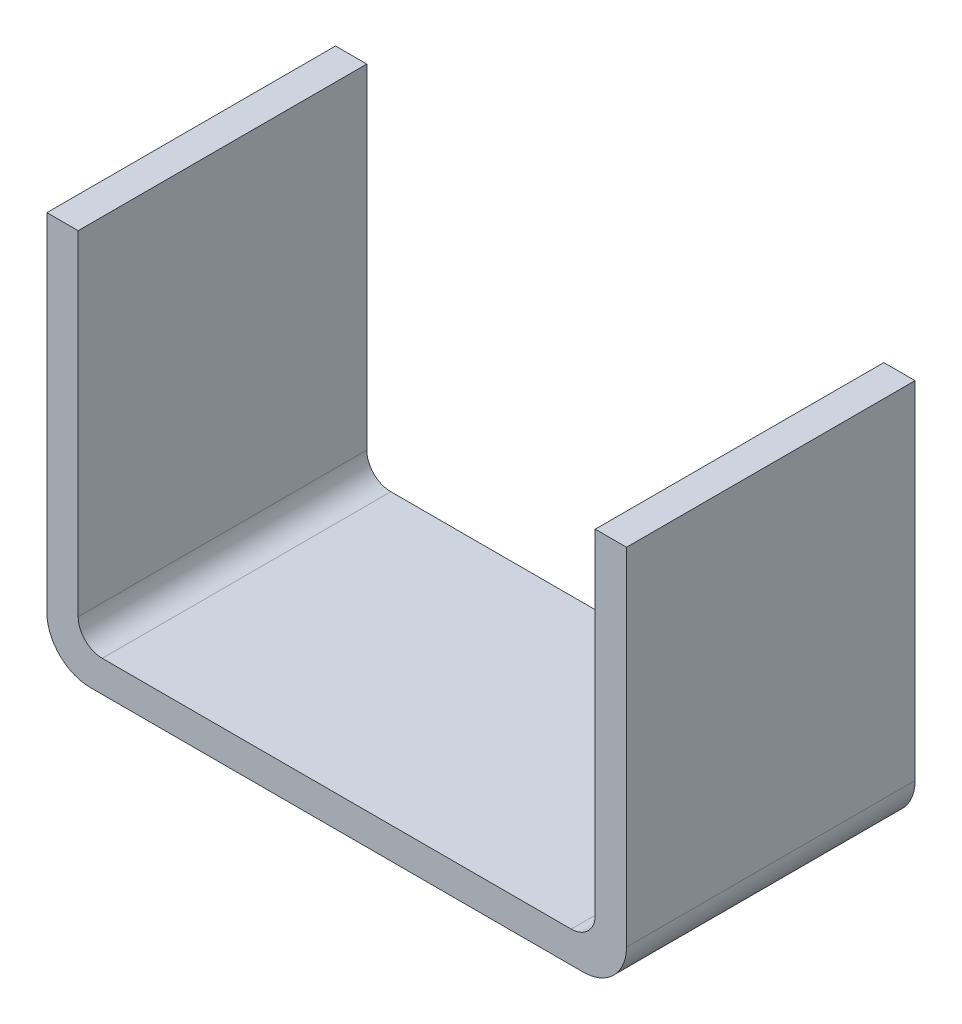
ISO-10303-21;
HEADER;
FILE_DESCRIPTION(('STEP AP214'),'2;1');
FILE_NAME('part.step','',(''),(''),'','','');
FILE_SCHEMA(('AUTOMOTIVE_DESIGN { 1 0 10303 214 1 1 1 1 }'));
ENDSEC;
DATA;
#1=APPLICATION_CONTEXT('core data for automotive mechanical design processes');
#2=APPLICATION_PROTOCOL_DEFINITION('international standard','automotive_design',2000,#1);
#3=PRODUCT_CONTEXT('',#1,'mechanical');
#4=PRODUCT('Part','Part','',(#3));
#5=PRODUCT_RELATED_PRODUCT_CATEGORY('part','',(#4));
#6=PRODUCT_DEFINITION_FORMATION('','',#4);
#7=PRODUCT_DEFINITION_CONTEXT('part definition',#1,'design');
#8=PRODUCT_DEFINITION('design','',#6,#7);
#9=PRODUCT_DEFINITION_SHAPE('','',#8);
#10=(LENGTH_UNIT() NAMED_UNIT(*) SI_UNIT(.MILLI.,.METRE.));
#11=(NAMED_UNIT(*) PLANE_ANGLE_UNIT() SI_UNIT($,.RADIAN.));
#12=(NAMED_UNIT(*) SI_UNIT($,.STERADIAN.) SOLID_ANGLE_UNIT());
#13=UNCERTAINTY_MEASURE_WITH_UNIT(LENGTH_MEASURE(1.E-05),#10,'distance_accuracy_value','');
#14=(GEOMETRIC_REPRESENTATION_CONTEXT(3) GLOBAL_UNCERTAINTY_ASSIGNED_CONTEXT((#13)) GLOBAL_UNIT_ASSIGNED_CONTEXT((#10,
#11,#12)) REPRESENTATION_CONTEXT('',''));
#15=CARTESIAN_POINT('',(0.,0.,0.));
#16=DIRECTION('',(0.,0.,1.));
#17=DIRECTION('',(1.,0.,0.));
#18=AXIS2_PLACEMENT_3D('',#15,#16,#17);
#19=CARTESIAN_POINT('',(22.3,-17.3101321586208,0.));
#20=DIRECTION('',(0.,0.,-1.));
#21=DIRECTION('',(0.707106781186547,-0.707106781186548,0.));
#22=AXIS2_PLACEMENT_3D('',#19,#20,#21);
#23=CYLINDRICAL_SURFACE('',#22,1.8);
#24=CARTESIAN_POINT('',(22.3,-17.3101321586208,-12.));
#25=DIRECTION('',(0.,0.,1.));
#26=DIRECTION('',(0.707106781186547,-0.707106781186548,0.));
#27=AXIS2_PLACEMENT_3D('',#24,#25,#26);
#28=CIRCLE('',#27,1.8);
#29=CARTESIAN_POINT('',(22.3,-19.1101321586208,-12.));
#30=VERTEX_POINT('',#29);
#31=CARTESIAN_POINT('',(24.1,-17.3101321586208,-12.));
#32=VERTEX_POINT('',#31);
#33=EDGE_CURVE('E20',#30,#32,#28,.T.);
#34=ORIENTED_EDGE('',*,*,#33,.T.);
#35=DIRECTION('',(0.,0.,1.));
#36=VECTOR('',#35,1.);
#37=CARTESIAN_POINT('',(24.1,-17.3101321586208,0.));
#38=LINE('',#37,#36);
#39=CARTESIAN_POINT('',(24.1,-17.3101321586208,0.));
#40=VERTEX_POINT('',#39);
#41=EDGE_CURVE('E11',#32,#40,#38,.T.);
#42=ORIENTED_EDGE('',*,*,#41,.T.);
#43=CARTESIAN_POINT('',(22.3,-17.3101321586208,0.));
#44=DIRECTION('',(0.,0.,-1.));
#45=DIRECTION('',(0.707106781186547,-0.707106781186548,0.));
#46=AXIS2_PLACEMENT_3D('',#43,#44,#45);
#47=CIRCLE('',#46,1.8);
#48=CARTESIAN_POINT('',(22.3,-19.1101321586208,0.));
#49=VERTEX_POINT('',#48);
#50=EDGE_CURVE('E198',#40,#49,#47,.T.);
#51=ORIENTED_EDGE('',*,*,#50,.T.);
#52=DIRECTION('',(0.,0.,-1.));
#53=VECTOR('',#52,1.);
#54=CARTESIAN_POINT('',(22.3,-19.1101321586208,0.));
#55=LINE('',#54,#53);
#56=EDGE_CURVE('E186',#49,#30,#55,.T.);
#57=ORIENTED_EDGE('',*,*,#56,.T.);
#58=EDGE_LOOP('',(#34,#42,#51,#57));
#59=FACE_BOUND('',#58,.T.);
#60=ADVANCED_FACE('F16',(#59),#23,.T.);
#61=CARTESIAN_POINT('',(24.1,-19.1101321586208,0.));
#62=DIRECTION('',(1.,0.,0.));
#63=DIRECTION('',(0.,1.,0.));
#64=AXIS2_PLACEMENT_3D('',#61,#62,#63);
#65=PLANE('',#64);
#66=ORIENTED_EDGE('',*,*,#41,.F.);
#67=DIRECTION('',(0.,1.,0.));
#68=VECTOR('',#67,1.);
#69=CARTESIAN_POINT('',(24.1,-19.1101321586208,-12.));
#70=LINE('',#69,#68);
#71=CARTESIAN_POINT('',(24.1,-2.91013215862079,-12.));
#72=VERTEX_POINT('',#71);
#73=EDGE_CURVE('E27',#32,#72,#70,.T.);
#74=ORIENTED_EDGE('',*,*,#73,.T.);
#75=DIRECTION('',(0.,0.,-1.));
#76=VECTOR('',#75,1.);
#77=CARTESIAN_POINT('',(24.1,-2.91013215862079,0.));
#78=LINE('',#77,#76);
#79=CARTESIAN_POINT('',(24.1,-2.91013215862079,0.));
#80=VERTEX_POINT('',#79);
#81=EDGE_CURVE('E191',#80,#72,#78,.T.);
#82=ORIENTED_EDGE('',*,*,#81,.F.);
#83=DIRECTION('',(0.,1.,0.));
#84=VECTOR('',#83,1.);
#85=CARTESIAN_POINT('',(24.1,-19.1101321586208,0.));
#86=LINE('',#85,#84);
#87=EDGE_CURVE('E202',#40,#80,#86,.T.);
#88=ORIENTED_EDGE('',*,*,#87,.F.);
#89=EDGE_LOOP('',(#66,#74,#82,#88));
#90=FACE_BOUND('',#89,.T.);
#91=ADVANCED_FACE('F274',(#90),#65,.T.);
#92=CARTESIAN_POINT('',(12.05,-13.7364002745628,-12.));
#93=DIRECTION('',(0.,0.,1.));
#94=DIRECTION('',(1.,0.,0.));
#95=AXIS2_PLACEMENT_3D('',#92,#93,#94);
#96=PLANE('',#95);
#97=ORIENTED_EDGE('',*,*,#33,.F.);
#98=DIRECTION('',(1.,0.,0.));
#99=VECTOR('',#98,1.);
#100=CARTESIAN_POINT('',(0.,-19.1101321586208,-12.));
#101=LINE('',#100,#99);
#102=CARTESIAN_POINT('',(1.8,-19.1101321586208,-12.));
#103=VERTEX_POINT('',#102);
#104=EDGE_CURVE('E173',#103,#30,#101,.T.);
#105=ORIENTED_EDGE('',*,*,#104,.F.);
#106=CARTESIAN_POINT('',(1.8,-17.3101321586208,-12.));
#107=DIRECTION('',(0.,0.,1.));
#108=DIRECTION('',(-0.707106781186547,-0.707106781186548,0.));
#109=AXIS2_PLACEMENT_3D('',#106,#107,#108);
#110=CIRCLE('',#109,1.8);
#111=CARTESIAN_POINT('',(0.,-17.3101321586208,-12.));
#112=VERTEX_POINT('',#111);
#113=EDGE_CURVE('E208',#112,#103,#110,.T.);
#114=ORIENTED_EDGE('',*,*,#113,.F.);
#115=DIRECTION('',(0.,-1.,0.));
#116=VECTOR('',#115,1.);
#117=CARTESIAN_POINT('',(0.,-2.9101321586208,-12.));
#118=LINE('',#117,#116);
#119=CARTESIAN_POINT('',(0.,-2.9101321586208,-12.));
#120=VERTEX_POINT('',#119);
#121=EDGE_CURVE('E211',#120,#112,#118,.T.);
#122=ORIENTED_EDGE('',*,*,#121,.F.);
#123=DIRECTION('',(-1.,0.,0.));
#124=VECTOR('',#123,1.);
#125=CARTESIAN_POINT('',(24.1,-2.91013215862079,-12.));
#126=LINE('',#125,#124);
#127=CARTESIAN_POINT('',(1.3,-2.9101321586208,-12.));
#128=VERTEX_POINT('',#127);
#129=EDGE_CURVE('E203',#128,#120,#126,.T.);
#130=ORIENTED_EDGE('',*,*,#129,.F.);
#131=DIRECTION('',(0.,1.,0.));
#132=VECTOR('',#131,1.);
#133=CARTESIAN_POINT('',(1.3,-17.8101321586208,-12.));
#134=LINE('',#133,#132);
#135=CARTESIAN_POINT('',(1.3,-16.8101321586208,-12.));
#136=VERTEX_POINT('',#135);
#137=EDGE_CURVE('E238',#136,#128,#134,.T.);
#138=ORIENTED_EDGE('',*,*,#137,.F.);
#139=CARTESIAN_POINT('',(2.3,-16.8101321586208,-12.));
#140=DIRECTION('',(0.,0.,-1.));
#141=DIRECTION('',(-0.707106781186548,-0.707106781186548,0.));
#142=AXIS2_PLACEMENT_3D('',#139,#140,#141);
#143=CIRCLE('',#142,1.);
#144=CARTESIAN_POINT('',(2.3,-17.8101321586208,-12.));
#145=VERTEX_POINT('',#144);
#146=EDGE_CURVE('E154',#145,#136,#143,.T.);
#147=ORIENTED_EDGE('',*,*,#146,.F.);
#148=DIRECTION('',(-1.,0.,0.));
#149=VECTOR('',#148,1.);
#150=CARTESIAN_POINT('',(22.8,-17.8101321586208,-12.));
#151=LINE('',#150,#149);
#152=CARTESIAN_POINT('',(21.8,-17.8101321586208,-12.));
#153=VERTEX_POINT('',#152);
#154=EDGE_CURVE('E133',#153,#145,#151,.T.);
#155=ORIENTED_EDGE('',*,*,#154,.F.);
#156=CARTESIAN_POINT('',(21.8,-16.8101321586208,-12.));
#157=DIRECTION('',(0.,0.,-1.));
#158=DIRECTION('',(0.707106781186549,-0.707106781186546,0.));
#159=AXIS2_PLACEMENT_3D('',#156,#157,#158);
#160=CIRCLE('',#159,1.);
#161=CARTESIAN_POINT('',(22.8,-16.8101321586208,-12.));
#162=VERTEX_POINT('',#161);
#163=EDGE_CURVE('E126',#162,#153,#160,.T.);
#164=ORIENTED_EDGE('',*,*,#163,.F.);
#165=DIRECTION('',(0.,-1.,0.));
#166=VECTOR('',#165,1.);
#167=CARTESIAN_POINT('',(22.8,-2.91013215862079,-12.));
#168=LINE('',#167,#166);
#169=CARTESIAN_POINT('',(22.8,-2.91013215862079,-12.));
#170=VERTEX_POINT('',#169);
#171=EDGE_CURVE('E130',#170,#162,#168,.T.);
#172=ORIENTED_EDGE('',*,*,#171,.F.);
#173=DIRECTION('',(-1.,0.,0.));
#174=VECTOR('',#173,1.);
#175=CARTESIAN_POINT('',(24.1,-2.91013215862079,-12.));
#176=LINE('',#175,#174);
#177=EDGE_CURVE('E235',#72,#170,#176,.T.);
#178=ORIENTED_EDGE('',*,*,#177,.F.);
#179=ORIENTED_EDGE('',*,*,#73,.F.);
#180=EDGE_LOOP('',(#97,#105,#114,#122,#130,#138,#147,#155,#164,#172,#178,#179));
#181=FACE_BOUND('',#180,.T.);
#182=ADVANCED_FACE('F128',(#181),#96,.F.);
#183=CARTESIAN_POINT('',(1.8,-17.3101321586208,0.));
#184=DIRECTION('',(0.,0.,-1.));
#185=DIRECTION('',(-0.707106781186547,-0.707106781186548,0.));
#186=AXIS2_PLACEMENT_3D('',#183,#184,#185);
#187=CYLINDRICAL_SURFACE('',#186,1.8);
#188=ORIENTED_EDGE('',*,*,#113,.T.);
#189=DIRECTION('',(0.,0.,1.));
#190=VECTOR('',#189,1.);
#191=CARTESIAN_POINT('',(1.8,-19.1101321586208,0.));
#192=LINE('',#191,#190);
#193=CARTESIAN_POINT('',(1.8,-19.1101321586208,0.));
#194=VERTEX_POINT('',#193);
#195=EDGE_CURVE('E190',#103,#194,#192,.T.);
#196=ORIENTED_EDGE('',*,*,#195,.T.);
#197=CARTESIAN_POINT('',(1.8,-17.3101321586208,0.));
#198=DIRECTION('',(0.,0.,-1.));
#199=DIRECTION('',(-0.707106781186547,-0.707106781186548,0.));
#200=AXIS2_PLACEMENT_3D('',#197,#198,#199);
#201=CIRCLE('',#200,1.8);
#202=CARTESIAN_POINT('',(0.,-17.3101321586208,0.));
#203=VERTEX_POINT('',#202);
#204=EDGE_CURVE('E174',#194,#203,#201,.T.);
#205=ORIENTED_EDGE('',*,*,#204,.T.);
#206=DIRECTION('',(0.,0.,-1.));
#207=VECTOR('',#206,1.);
#208=CARTESIAN_POINT('',(0.,-17.3101321586208,0.));
#209=LINE('',#208,#207);
#210=EDGE_CURVE('E138',#203,#112,#209,.T.);
#211=ORIENTED_EDGE('',*,*,#210,.T.);
#212=EDGE_LOOP('',(#188,#196,#205,#211));
#213=FACE_BOUND('',#212,.T.);
#214=ADVANCED_FACE('F286',(#213),#187,.T.);
#215=CARTESIAN_POINT('',(0.,-2.9101321586208,0.));
#216=DIRECTION('',(-1.,0.,0.));
#217=DIRECTION('',(0.,1.,0.));
#218=AXIS2_PLACEMENT_3D('',#215,#216,#217);
#219=PLANE('',#218);
#220=ORIENTED_EDGE('',*,*,#210,.F.);
#221=DIRECTION('',(0.,-1.,0.));
#222=VECTOR('',#221,1.);
#223=CARTESIAN_POINT('',(0.,-2.9101321586208,0.));
#224=LINE('',#223,#222);
#225=CARTESIAN_POINT('',(0.,-2.9101321586208,0.));
#226=VERTEX_POINT('',#225);
#227=EDGE_CURVE('E179',#226,#203,#224,.T.);
#228=ORIENTED_EDGE('',*,*,#227,.F.);
#229=DIRECTION('',(0.,0.,-1.));
#230=VECTOR('',#229,1.);
#231=CARTESIAN_POINT('',(0.,-2.91013215862079,0.));
#232=LINE('',#231,#230);
#233=EDGE_CURVE('E207',#226,#120,#232,.T.);
#234=ORIENTED_EDGE('',*,*,#233,.T.);
#235=ORIENTED_EDGE('',*,*,#121,.T.);
#236=EDGE_LOOP('',(#220,#228,#234,#235));
#237=FACE_BOUND('',#236,.T.);
#238=ADVANCED_FACE('F301',(#237),#219,.T.);
#239=CARTESIAN_POINT('',(21.8,-16.8101321586208,0.));
#240=DIRECTION('',(0.,0.,-1.));
#241=DIRECTION('',(0.707106781186549,-0.707106781186546,0.));
#242=AXIS2_PLACEMENT_3D('',#239,#240,#241);
#243=CYLINDRICAL_SURFACE('',#242,1.);
#244=CARTESIAN_POINT('',(21.8,-16.8101321586208,0.));
#245=DIRECTION('',(0.,0.,1.));
#246=DIRECTION('',(0.707106781186549,-0.707106781186546,0.));
#247=AXIS2_PLACEMENT_3D('',#244,#245,#246);
#248=CIRCLE('',#247,1.);
#249=CARTESIAN_POINT('',(21.8,-17.8101321586208,0.));
#250=VERTEX_POINT('',#249);
#251=CARTESIAN_POINT('',(22.8,-16.8101321586208,0.));
#252=VERTEX_POINT('',#251);
#253=EDGE_CURVE('E151',#250,#252,#248,.T.);
#254=ORIENTED_EDGE('',*,*,#253,.T.);
#255=DIRECTION('',(0.,0.,-1.));
#256=VECTOR('',#255,1.);
#257=CARTESIAN_POINT('',(22.8,-16.8101321586208,0.));
#258=LINE('',#257,#256);
#259=EDGE_CURVE('E143',#252,#162,#258,.T.);
#260=ORIENTED_EDGE('',*,*,#259,.T.);
#261=ORIENTED_EDGE('',*,*,#163,.T.);
#262=DIRECTION('',(0.,0.,1.));
#263=VECTOR('',#262,1.);
#264=CARTESIAN_POINT('',(21.8,-17.8101321586208,0.));
#265=LINE('',#264,#263);
#266=EDGE_CURVE('E170',#153,#250,#265,.T.);
#267=ORIENTED_EDGE('',*,*,#266,.T.);
#268=EDGE_LOOP('',(#254,#260,#261,#267));
#269=FACE_BOUND('',#268,.T.);
#270=ADVANCED_FACE('F149',(#269),#243,.F.);
#271=CARTESIAN_POINT('',(22.8,-2.91013215862079,0.));
#272=DIRECTION('',(-1.,0.,0.));
#273=DIRECTION('',(0.,0.,1.));
#274=AXIS2_PLACEMENT_3D('',#271,#272,#273);
#275=PLANE('',#274);
#276=ORIENTED_EDGE('',*,*,#259,.F.);
#277=DIRECTION('',(0.,-1.,0.));
#278=VECTOR('',#277,1.);
#279=CARTESIAN_POINT('',(22.8,-2.91013215862079,0.));
#280=LINE('',#279,#278);
#281=CARTESIAN_POINT('',(22.8,-2.91013215862079,0.));
#282=VERTEX_POINT('',#281);
#283=EDGE_CURVE('E244',#282,#252,#280,.T.);
#284=ORIENTED_EDGE('',*,*,#283,.F.);
#285=DIRECTION('',(0.,0.,-1.));
#286=VECTOR('',#285,1.);
#287=CARTESIAN_POINT('',(22.8,-2.91013215862079,0.));
#288=LINE('',#287,#286);
#289=EDGE_CURVE('E145',#282,#170,#288,.T.);
#290=ORIENTED_EDGE('',*,*,#289,.T.);
#291=ORIENTED_EDGE('',*,*,#171,.T.);
#292=EDGE_LOOP('',(#276,#284,#290,#291));
#293=FACE_BOUND('',#292,.T.);
#294=ADVANCED_FACE('F141',(#293),#275,.T.);
#295=CARTESIAN_POINT('',(2.3,-16.8101321586208,0.));
#296=DIRECTION('',(0.,0.,-1.));
#297=DIRECTION('',(-0.707106781186548,-0.707106781186548,0.));
#298=AXIS2_PLACEMENT_3D('',#295,#296,#297);
#299=CYLINDRICAL_SURFACE('',#298,1.);
#300=CARTESIAN_POINT('',(2.3,-16.8101321586208,0.));
#301=DIRECTION('',(0.,0.,1.));
#302=DIRECTION('',(-0.707106781186548,-0.707106781186548,0.));
#303=AXIS2_PLACEMENT_3D('',#300,#301,#302);
#304=CIRCLE('',#303,1.);
#305=CARTESIAN_POINT('',(1.3,-16.8101321586208,0.));
#306=VERTEX_POINT('',#305);
#307=CARTESIAN_POINT('',(2.3,-17.8101321586208,0.));
#308=VERTEX_POINT('',#307);
#309=EDGE_CURVE('E169',#306,#308,#304,.T.);
#310=ORIENTED_EDGE('',*,*,#309,.T.);
#311=DIRECTION('',(0.,0.,-1.));
#312=VECTOR('',#311,1.);
#313=CARTESIAN_POINT('',(2.3,-17.8101321586208,0.));
#314=LINE('',#313,#312);
#315=EDGE_CURVE('E159',#308,#145,#314,.T.);
#316=ORIENTED_EDGE('',*,*,#315,.T.);
#317=ORIENTED_EDGE('',*,*,#146,.T.);
#318=DIRECTION('',(0.,0.,1.));
#319=VECTOR('',#318,1.);
#320=CARTESIAN_POINT('',(1.3,-16.8101321586208,0.));
#321=LINE('',#320,#319);
#322=EDGE_CURVE('E221',#136,#306,#321,.T.);
#323=ORIENTED_EDGE('',*,*,#322,.T.);
#324=EDGE_LOOP('',(#310,#316,#317,#323));
#325=FACE_BOUND('',#324,.T.);
#326=ADVANCED_FACE('F305',(#325),#299,.F.);
#327=CARTESIAN_POINT('',(22.8,-17.8101321586208,0.));
#328=DIRECTION('',(0.,1.,0.));
#329=DIRECTION('',(1.,0.,0.));
#330=AXIS2_PLACEMENT_3D('',#327,#328,#329);
#331=PLANE('',#330);
#332=ORIENTED_EDGE('',*,*,#266,.F.);
#333=ORIENTED_EDGE('',*,*,#154,.T.);
#334=ORIENTED_EDGE('',*,*,#315,.F.);
#335=DIRECTION('',(-1.,0.,0.));
#336=VECTOR('',#335,1.);
#337=CARTESIAN_POINT('',(22.8,-17.8101321586208,0.));
#338=LINE('',#337,#336);
#339=EDGE_CURVE('E194',#250,#308,#338,.T.);
#340=ORIENTED_EDGE('',*,*,#339,.F.);
#341=EDGE_LOOP('',(#332,#333,#334,#340));
#342=FACE_BOUND('',#341,.T.);
#343=ADVANCED_FACE('F307',(#342),#331,.T.);
#344=CARTESIAN_POINT('',(0.,-19.1101321586208,0.));
#345=DIRECTION('',(0.,-1.,0.));
#346=DIRECTION('',(0.,0.,-1.));
#347=AXIS2_PLACEMENT_3D('',#344,#345,#346);
#348=PLANE('',#347);
#349=ORIENTED_EDGE('',*,*,#56,.F.);
#350=DIRECTION('',(1.,0.,0.));
#351=VECTOR('',#350,1.);
#352=CARTESIAN_POINT('',(0.,-19.1101321586208,0.));
#353=LINE('',#352,#351);
#354=EDGE_CURVE('E178',#194,#49,#353,.T.);
#355=ORIENTED_EDGE('',*,*,#354,.F.);
#356=ORIENTED_EDGE('',*,*,#195,.F.);
#357=ORIENTED_EDGE('',*,*,#104,.T.);
#358=EDGE_LOOP('',(#349,#355,#356,#357));
#359=FACE_BOUND('',#358,.T.);
#360=ADVANCED_FACE('F284',(#359),#348,.T.);
#361=CARTESIAN_POINT('',(24.1,-2.91013215862079,0.));
#362=DIRECTION('',(0.,1.,0.));
#363=DIRECTION('',(1.,0.,0.));
#364=AXIS2_PLACEMENT_3D('',#361,#362,#363);
#365=PLANE('',#364);
#366=ORIENTED_EDGE('',*,*,#177,.T.);
#367=ORIENTED_EDGE('',*,*,#289,.F.);
#368=DIRECTION('',(-1.,0.,0.));
#369=VECTOR('',#368,1.);
#370=CARTESIAN_POINT('',(24.1,-2.91013215862079,0.));
#371=LINE('',#370,#369);
#372=EDGE_CURVE('E234',#80,#282,#371,.T.);
#373=ORIENTED_EDGE('',*,*,#372,.F.);
#374=ORIENTED_EDGE('',*,*,#81,.T.);
#375=EDGE_LOOP('',(#366,#367,#373,#374));
#376=FACE_BOUND('',#375,.T.);
#377=ADVANCED_FACE('F277',(#376),#365,.T.);
#378=CARTESIAN_POINT('',(1.3,-17.8101321586208,0.));
#379=DIRECTION('',(1.,0.,0.));
#380=DIRECTION('',(0.,1.,0.));
#381=AXIS2_PLACEMENT_3D('',#378,#379,#380);
#382=PLANE('',#381);
#383=ORIENTED_EDGE('',*,*,#322,.F.);
#384=ORIENTED_EDGE('',*,*,#137,.T.);
#385=DIRECTION('',(0.,0.,-1.));
#386=VECTOR('',#385,1.);
#387=CARTESIAN_POINT('',(1.3,-2.91013215862079,0.));
#388=LINE('',#387,#386);
#389=CARTESIAN_POINT('',(1.3,-2.9101321586208,0.));
#390=VERTEX_POINT('',#389);
#391=EDGE_CURVE('E215',#390,#128,#388,.T.);
#392=ORIENTED_EDGE('',*,*,#391,.F.);
#393=DIRECTION('',(0.,1.,0.));
#394=VECTOR('',#393,1.);
#395=CARTESIAN_POINT('',(1.3,-17.8101321586208,0.));
#396=LINE('',#395,#394);
#397=EDGE_CURVE('E164',#306,#390,#396,.T.);
#398=ORIENTED_EDGE('',*,*,#397,.F.);
#399=EDGE_LOOP('',(#383,#384,#392,#398));
#400=FACE_BOUND('',#399,.T.);
#401=ADVANCED_FACE('F18',(#400),#382,.T.);
#402=CARTESIAN_POINT('',(24.1,-2.91013215862079,0.));
#403=DIRECTION('',(0.,1.,0.));
#404=DIRECTION('',(1.,0.,0.));
#405=AXIS2_PLACEMENT_3D('',#402,#403,#404);
#406=PLANE('',#405);
#407=ORIENTED_EDGE('',*,*,#129,.T.);
#408=ORIENTED_EDGE('',*,*,#233,.F.);
#409=DIRECTION('',(-1.,0.,0.));
#410=VECTOR('',#409,1.);
#411=CARTESIAN_POINT('',(12.05,-2.91013215862079,0.));
#412=LINE('',#411,#410);
#413=EDGE_CURVE('E168',#390,#226,#412,.T.);
#414=ORIENTED_EDGE('',*,*,#413,.F.);
#415=ORIENTED_EDGE('',*,*,#391,.T.);
#416=EDGE_LOOP('',(#407,#408,#414,#415));
#417=FACE_BOUND('',#416,.T.);
#418=ADVANCED_FACE('F298',(#417),#406,.T.);
#419=CARTESIAN_POINT('',(12.05,-13.7364002745628,0.));
#420=DIRECTION('',(0.,0.,1.));
#421=DIRECTION('',(1.,0.,0.));
#422=AXIS2_PLACEMENT_3D('',#419,#420,#421);
#423=PLANE('',#422);
#424=ORIENTED_EDGE('',*,*,#50,.F.);
#425=ORIENTED_EDGE('',*,*,#87,.T.);
#426=ORIENTED_EDGE('',*,*,#372,.T.);
#427=ORIENTED_EDGE('',*,*,#283,.T.);
#428=ORIENTED_EDGE('',*,*,#253,.F.);
#429=ORIENTED_EDGE('',*,*,#339,.T.);
#430=ORIENTED_EDGE('',*,*,#309,.F.);
#431=ORIENTED_EDGE('',*,*,#397,.T.);
#432=ORIENTED_EDGE('',*,*,#413,.T.);
#433=ORIENTED_EDGE('',*,*,#227,.T.);
#434=ORIENTED_EDGE('',*,*,#204,.F.);
#435=ORIENTED_EDGE('',*,*,#354,.T.);
#436=EDGE_LOOP('',(#424,#425,#426,#427,#428,#429,#430,#431,#432,#433,#434,#435));
#437=FACE_BOUND('',#436,.T.);
#438=ADVANCED_FACE('F269',(#437),#423,.T.);
#439=CLOSED_SHELL('',(#60,#91,#182,#214,#238,#270,#294,#326,#343,#360,#377,#401,#418,#438));
#440=MANIFOLD_SOLID_BREP('B1',#439);
#441=ADVANCED_BREP_SHAPE_REPRESENTATION('',(#18,#440),#14);
#442=SHAPE_DEFINITION_REPRESENTATION(#9,#441);
ENDSEC;
END-ISO-10303-21;
